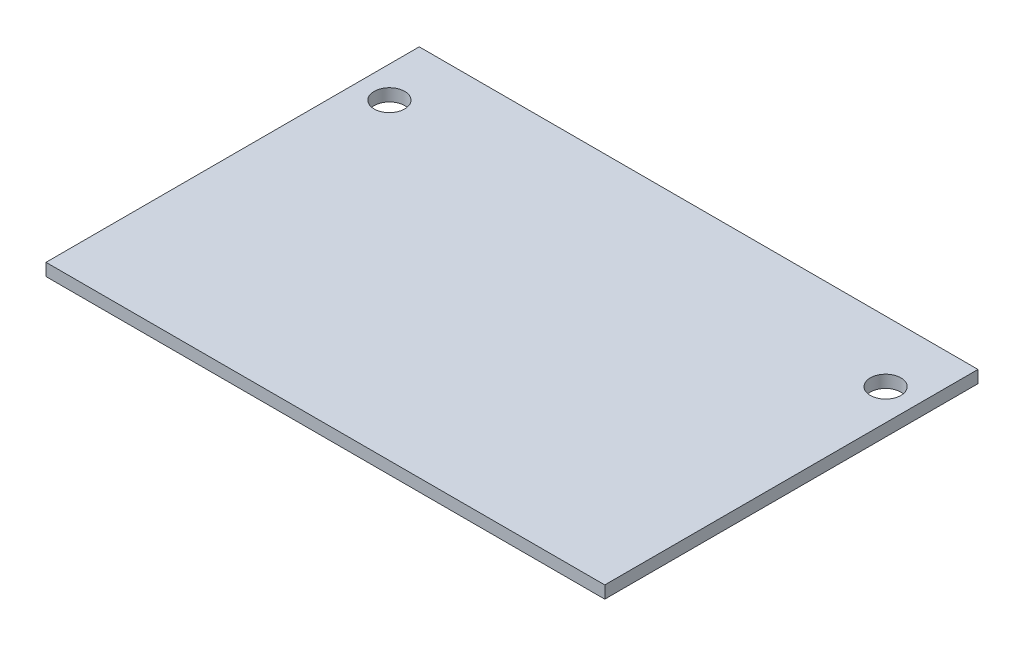
ISO-10303-21;
HEADER;
FILE_DESCRIPTION(('STEP AP214'),'2;1');
FILE_NAME('part.step','',(''),(''),'','','');
FILE_SCHEMA(('AUTOMOTIVE_DESIGN { 1 0 10303 214 1 1 1 1 }'));
ENDSEC;
DATA;
#1=APPLICATION_CONTEXT('core data for automotive mechanical design processes');
#2=APPLICATION_PROTOCOL_DEFINITION('international standard','automotive_design',2000,#1);
#3=PRODUCT_CONTEXT('',#1,'mechanical');
#4=PRODUCT('Part','Part','',(#3));
#5=PRODUCT_RELATED_PRODUCT_CATEGORY('part','',(#4));
#6=PRODUCT_DEFINITION_FORMATION('','',#4);
#7=PRODUCT_DEFINITION_CONTEXT('part definition',#1,'design');
#8=PRODUCT_DEFINITION('design','',#6,#7);
#9=PRODUCT_DEFINITION_SHAPE('','',#8);
#10=(LENGTH_UNIT() NAMED_UNIT(*) SI_UNIT(.MILLI.,.METRE.));
#11=(NAMED_UNIT(*) PLANE_ANGLE_UNIT() SI_UNIT($,.RADIAN.));
#12=(NAMED_UNIT(*) SI_UNIT($,.STERADIAN.) SOLID_ANGLE_UNIT());
#13=UNCERTAINTY_MEASURE_WITH_UNIT(LENGTH_MEASURE(1.E-05),#10,'distance_accuracy_value','');
#14=(GEOMETRIC_REPRESENTATION_CONTEXT(3) GLOBAL_UNCERTAINTY_ASSIGNED_CONTEXT((#13)) GLOBAL_UNIT_ASSIGNED_CONTEXT((#10,
#11,#12)) REPRESENTATION_CONTEXT('',''));
#15=CARTESIAN_POINT('',(0.,0.,0.));
#16=DIRECTION('',(0.,0.,1.));
#17=DIRECTION('',(1.,0.,0.));
#18=AXIS2_PLACEMENT_3D('',#15,#16,#17);
#19=CARTESIAN_POINT('',(38.4,1.7,-25.65));
#20=DIRECTION('',(-1.,0.,0.));
#21=DIRECTION('',(0.,0.,1.));
#22=AXIS2_PLACEMENT_3D('',#19,#20,#21);
#23=PLANE('',#22);
#24=DIRECTION('',(0.,0.,-1.));
#25=VECTOR('',#24,1.);
#26=CARTESIAN_POINT('',(38.4,0.,-25.65));
#27=LINE('',#26,#25);
#28=CARTESIAN_POINT('',(38.4,0.,25.65));
#29=VERTEX_POINT('',#28);
#30=CARTESIAN_POINT('',(38.4,0.,-25.65));
#31=VERTEX_POINT('',#30);
#32=EDGE_CURVE('E114',#29,#31,#27,.T.);
#33=ORIENTED_EDGE('',*,*,#32,.T.);
#34=DIRECTION('',(0.,-1.,0.));
#35=VECTOR('',#34,1.);
#36=CARTESIAN_POINT('',(38.4,1.7,-25.65));
#37=LINE('',#36,#35);
#38=CARTESIAN_POINT('',(38.4,1.7,-25.65));
#39=VERTEX_POINT('',#38);
#40=EDGE_CURVE('E11',#39,#31,#37,.T.);
#41=ORIENTED_EDGE('',*,*,#40,.F.);
#42=DIRECTION('',(0.,0.,-1.));
#43=VECTOR('',#42,1.);
#44=CARTESIAN_POINT('',(38.4,1.7,-25.65));
#45=LINE('',#44,#43);
#46=CARTESIAN_POINT('',(38.4,1.7,25.65));
#47=VERTEX_POINT('',#46);
#48=EDGE_CURVE('E98',#47,#39,#45,.T.);
#49=ORIENTED_EDGE('',*,*,#48,.F.);
#50=DIRECTION('',(0.,-1.,0.));
#51=VECTOR('',#50,1.);
#52=CARTESIAN_POINT('',(38.4,1.7,25.65));
#53=LINE('',#52,#51);
#54=EDGE_CURVE('E110',#47,#29,#53,.T.);
#55=ORIENTED_EDGE('',*,*,#54,.T.);
#56=EDGE_LOOP('',(#33,#41,#49,#55));
#57=FACE_BOUND('',#56,.T.);
#58=ADVANCED_FACE('F46',(#57),#23,.F.);
#59=CARTESIAN_POINT('',(-38.4,1.7,-25.65));
#60=DIRECTION('',(0.,0.,1.));
#61=DIRECTION('',(1.,0.,0.));
#62=AXIS2_PLACEMENT_3D('',#59,#60,#61);
#63=PLANE('',#62);
#64=DIRECTION('',(-1.,0.,0.));
#65=VECTOR('',#64,1.);
#66=CARTESIAN_POINT('',(-38.4,0.,-25.65));
#67=LINE('',#66,#65);
#68=CARTESIAN_POINT('',(-38.4,0.,-25.65));
#69=VERTEX_POINT('',#68);
#70=EDGE_CURVE('E103',#31,#69,#67,.T.);
#71=ORIENTED_EDGE('',*,*,#70,.T.);
#72=DIRECTION('',(0.,-1.,0.));
#73=VECTOR('',#72,1.);
#74=CARTESIAN_POINT('',(-38.4,1.7,-25.65));
#75=LINE('',#74,#73);
#76=CARTESIAN_POINT('',(-38.4,1.7,-25.65));
#77=VERTEX_POINT('',#76);
#78=EDGE_CURVE('E55',#77,#69,#75,.T.);
#79=ORIENTED_EDGE('',*,*,#78,.F.);
#80=DIRECTION('',(-1.,0.,0.));
#81=VECTOR('',#80,1.);
#82=CARTESIAN_POINT('',(-38.4,1.7,-25.65));
#83=LINE('',#82,#81);
#84=EDGE_CURVE('E93',#39,#77,#83,.T.);
#85=ORIENTED_EDGE('',*,*,#84,.F.);
#86=ORIENTED_EDGE('',*,*,#40,.T.);
#87=EDGE_LOOP('',(#71,#79,#85,#86));
#88=FACE_BOUND('',#87,.T.);
#89=ADVANCED_FACE('F102',(#88),#63,.F.);
#90=CARTESIAN_POINT('',(-38.4,1.7,-25.65));
#91=DIRECTION('',(1.,0.,0.));
#92=DIRECTION('',(0.,0.,-1.));
#93=AXIS2_PLACEMENT_3D('',#90,#91,#92);
#94=PLANE('',#93);
#95=DIRECTION('',(0.,0.,1.));
#96=VECTOR('',#95,1.);
#97=CARTESIAN_POINT('',(-38.4,0.,-25.65));
#98=LINE('',#97,#96);
#99=CARTESIAN_POINT('',(-38.4,0.,25.65));
#100=VERTEX_POINT('',#99);
#101=EDGE_CURVE('E80',#69,#100,#98,.T.);
#102=ORIENTED_EDGE('',*,*,#101,.T.);
#103=DIRECTION('',(0.,-1.,0.));
#104=VECTOR('',#103,1.);
#105=CARTESIAN_POINT('',(-38.4,1.7,25.65));
#106=LINE('',#105,#104);
#107=CARTESIAN_POINT('',(-38.4,1.7,25.65));
#108=VERTEX_POINT('',#107);
#109=EDGE_CURVE('E105',#108,#100,#106,.T.);
#110=ORIENTED_EDGE('',*,*,#109,.F.);
#111=DIRECTION('',(0.,0.,1.));
#112=VECTOR('',#111,1.);
#113=CARTESIAN_POINT('',(-38.4,1.7,-25.65));
#114=LINE('',#113,#112);
#115=EDGE_CURVE('E96',#77,#108,#114,.T.);
#116=ORIENTED_EDGE('',*,*,#115,.F.);
#117=ORIENTED_EDGE('',*,*,#78,.T.);
#118=EDGE_LOOP('',(#102,#110,#116,#117));
#119=FACE_BOUND('',#118,.T.);
#120=ADVANCED_FACE('F106',(#119),#94,.F.);
#121=CARTESIAN_POINT('',(-38.4,1.7,25.65));
#122=DIRECTION('',(0.,0.,-1.));
#123=DIRECTION('',(-1.,0.,0.));
#124=AXIS2_PLACEMENT_3D('',#121,#122,#123);
#125=PLANE('',#124);
#126=DIRECTION('',(1.,0.,0.));
#127=VECTOR('',#126,1.);
#128=CARTESIAN_POINT('',(-38.4,0.,25.65));
#129=LINE('',#128,#127);
#130=EDGE_CURVE('E86',#100,#29,#129,.T.);
#131=ORIENTED_EDGE('',*,*,#130,.T.);
#132=ORIENTED_EDGE('',*,*,#54,.F.);
#133=DIRECTION('',(1.,0.,0.));
#134=VECTOR('',#133,1.);
#135=CARTESIAN_POINT('',(-38.4,1.7,25.65));
#136=LINE('',#135,#134);
#137=EDGE_CURVE('E63',#108,#47,#136,.T.);
#138=ORIENTED_EDGE('',*,*,#137,.F.);
#139=ORIENTED_EDGE('',*,*,#109,.T.);
#140=EDGE_LOOP('',(#131,#132,#138,#139));
#141=FACE_BOUND('',#140,.T.);
#142=ADVANCED_FACE('F128',(#141),#125,.F.);
#143=CARTESIAN_POINT('',(0.,1.7,0.));
#144=DIRECTION('',(0.,1.,0.));
#145=DIRECTION('',(0.,0.,1.));
#146=AXIS2_PLACEMENT_3D('',#143,#144,#145);
#147=PLANE('',#146);
#148=CARTESIAN_POINT('',(34.1,1.7,-17.25));
#149=DIRECTION('',(0.,1.,0.));
#150=DIRECTION('',(0.,0.,1.));
#151=AXIS2_PLACEMENT_3D('',#148,#149,#150);
#152=CIRCLE('',#151,2.1);
#153=CARTESIAN_POINT('',(34.1,1.7,-15.15));
#154=VERTEX_POINT('',#153);
#155=EDGE_CURVE('E143',#154,#154,#152,.T.);
#156=ORIENTED_EDGE('',*,*,#155,.F.);
#157=EDGE_LOOP('',(#156));
#158=FACE_BOUND('',#157,.T.);
#159=CARTESIAN_POINT('',(-34.1,1.7,-17.25));
#160=DIRECTION('',(0.,1.,0.));
#161=DIRECTION('',(0.,0.,-1.));
#162=AXIS2_PLACEMENT_3D('',#159,#160,#161);
#163=CIRCLE('',#162,2.1);
#164=CARTESIAN_POINT('',(-34.1,1.7,-19.35));
#165=VERTEX_POINT('',#164);
#166=EDGE_CURVE('E139',#165,#165,#163,.T.);
#167=ORIENTED_EDGE('',*,*,#166,.F.);
#168=EDGE_LOOP('',(#167));
#169=FACE_BOUND('',#168,.T.);
#170=ORIENTED_EDGE('',*,*,#48,.T.);
#171=ORIENTED_EDGE('',*,*,#84,.T.);
#172=ORIENTED_EDGE('',*,*,#115,.T.);
#173=ORIENTED_EDGE('',*,*,#137,.T.);
#174=EDGE_LOOP('',(#170,#171,#172,#173));
#175=FACE_BOUND('',#174,.T.);
#176=ADVANCED_FACE('F94',(#158,#169,#175),#147,.T.);
#177=CARTESIAN_POINT('',(0.,0.,0.));
#178=DIRECTION('',(0.,1.,0.));
#179=DIRECTION('',(0.,0.,1.));
#180=AXIS2_PLACEMENT_3D('',#177,#178,#179);
#181=PLANE('',#180);
#182=CARTESIAN_POINT('',(34.1,0.,-17.25));
#183=DIRECTION('',(0.,1.,0.));
#184=DIRECTION('',(0.,0.,1.));
#185=AXIS2_PLACEMENT_3D('',#182,#183,#184);
#186=CIRCLE('',#185,2.1);
#187=CARTESIAN_POINT('',(34.1,0.,-15.15));
#188=VERTEX_POINT('',#187);
#189=EDGE_CURVE('E118',#188,#188,#186,.T.);
#190=ORIENTED_EDGE('',*,*,#189,.T.);
#191=EDGE_LOOP('',(#190));
#192=FACE_BOUND('',#191,.T.);
#193=CARTESIAN_POINT('',(-34.1,0.,-17.25));
#194=DIRECTION('',(0.,1.,0.));
#195=DIRECTION('',(0.,0.,-1.));
#196=AXIS2_PLACEMENT_3D('',#193,#194,#195);
#197=CIRCLE('',#196,2.1);
#198=CARTESIAN_POINT('',(-34.1,0.,-19.35));
#199=VERTEX_POINT('',#198);
#200=EDGE_CURVE('E135',#199,#199,#197,.T.);
#201=ORIENTED_EDGE('',*,*,#200,.T.);
#202=EDGE_LOOP('',(#201));
#203=FACE_BOUND('',#202,.T.);
#204=ORIENTED_EDGE('',*,*,#32,.F.);
#205=ORIENTED_EDGE('',*,*,#130,.F.);
#206=ORIENTED_EDGE('',*,*,#101,.F.);
#207=ORIENTED_EDGE('',*,*,#70,.F.);
#208=EDGE_LOOP('',(#204,#205,#206,#207));
#209=FACE_BOUND('',#208,.T.);
#210=ADVANCED_FACE('F131',(#192,#203,#209),#181,.F.);
#211=CARTESIAN_POINT('',(-34.1,0.,-17.25));
#212=DIRECTION('',(0.,1.,0.));
#213=DIRECTION('',(0.,0.,1.));
#214=AXIS2_PLACEMENT_3D('',#211,#212,#213);
#215=CYLINDRICAL_SURFACE('',#214,2.1);
#216=ORIENTED_EDGE('',*,*,#200,.F.);
#217=EDGE_LOOP('',(#216));
#218=FACE_BOUND('',#217,.T.);
#219=ORIENTED_EDGE('',*,*,#166,.T.);
#220=EDGE_LOOP('',(#219));
#221=FACE_BOUND('',#220,.T.);
#222=ADVANCED_FACE('F156',(#218,#221),#215,.F.);
#223=CARTESIAN_POINT('',(34.1,0.,-17.25));
#224=DIRECTION('',(0.,1.,0.));
#225=DIRECTION('',(0.,0.,1.));
#226=AXIS2_PLACEMENT_3D('',#223,#224,#225);
#227=CYLINDRICAL_SURFACE('',#226,2.1);
#228=ORIENTED_EDGE('',*,*,#189,.F.);
#229=EDGE_LOOP('',(#228));
#230=FACE_BOUND('',#229,.T.);
#231=ORIENTED_EDGE('',*,*,#155,.T.);
#232=EDGE_LOOP('',(#231));
#233=FACE_BOUND('',#232,.T.);
#234=ADVANCED_FACE('F153',(#230,#233),#227,.F.);
#235=CLOSED_SHELL('',(#58,#89,#120,#142,#176,#210,#222,#234));
#236=MANIFOLD_SOLID_BREP('B2',#235);
#237=ADVANCED_BREP_SHAPE_REPRESENTATION('',(#18,#236),#14);
#238=SHAPE_DEFINITION_REPRESENTATION(#9,#237);
ENDSEC;
END-ISO-10303-21;
